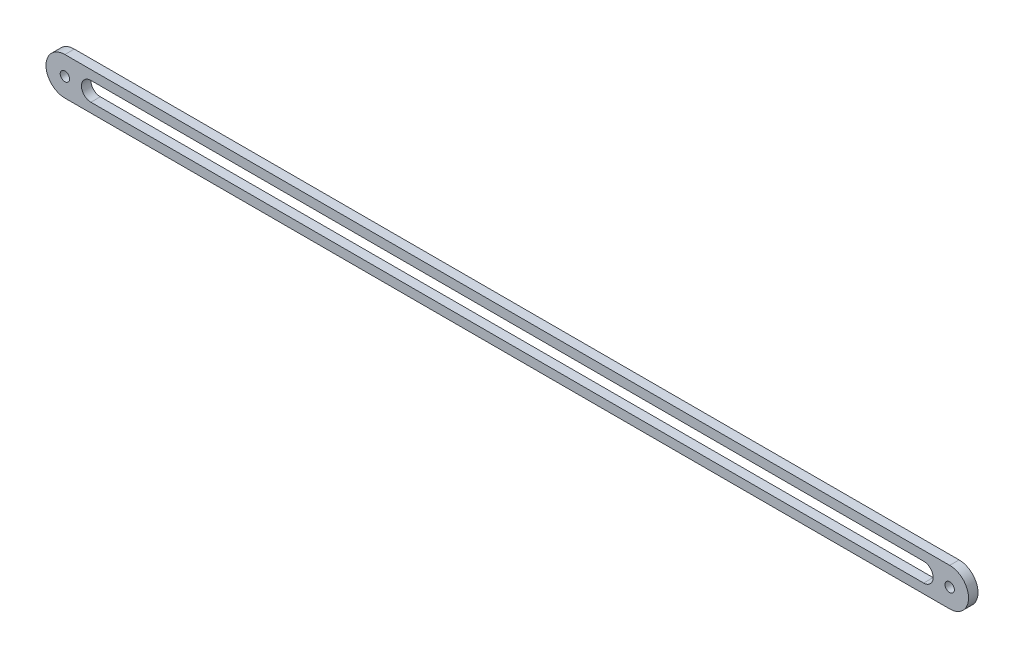
ISO-10303-21;
HEADER;
FILE_DESCRIPTION(('STEP AP214'),'2;1');
FILE_NAME('part.step','',(''),(''),'','','');
FILE_SCHEMA(('AUTOMOTIVE_DESIGN { 1 0 10303 214 1 1 1 1 }'));
ENDSEC;
DATA;
#1=APPLICATION_CONTEXT('core data for automotive mechanical design processes');
#2=APPLICATION_PROTOCOL_DEFINITION('international standard','automotive_design',2000,#1);
#3=PRODUCT_CONTEXT('',#1,'mechanical');
#4=PRODUCT('Part','Part','',(#3));
#5=PRODUCT_RELATED_PRODUCT_CATEGORY('part','',(#4));
#6=PRODUCT_DEFINITION_FORMATION('','',#4);
#7=PRODUCT_DEFINITION_CONTEXT('part definition',#1,'design');
#8=PRODUCT_DEFINITION('design','',#6,#7);
#9=PRODUCT_DEFINITION_SHAPE('','',#8);
#10=(LENGTH_UNIT() NAMED_UNIT(*) SI_UNIT(.MILLI.,.METRE.));
#11=(NAMED_UNIT(*) PLANE_ANGLE_UNIT() SI_UNIT($,.RADIAN.));
#12=(NAMED_UNIT(*) SI_UNIT($,.STERADIAN.) SOLID_ANGLE_UNIT());
#13=UNCERTAINTY_MEASURE_WITH_UNIT(LENGTH_MEASURE(1.E-05),#10,'distance_accuracy_value','');
#14=(GEOMETRIC_REPRESENTATION_CONTEXT(3) GLOBAL_UNCERTAINTY_ASSIGNED_CONTEXT((#13)) GLOBAL_UNIT_ASSIGNED_CONTEXT((#10,
#11,#12)) REPRESENTATION_CONTEXT('',''));
#15=CARTESIAN_POINT('',(0.,0.,0.));
#16=DIRECTION('',(0.,0.,1.));
#17=DIRECTION('',(1.,0.,0.));
#18=AXIS2_PLACEMENT_3D('',#15,#16,#17);
#19=CARTESIAN_POINT('',(-150.,2.22044604925031E-13,1.6));
#20=DIRECTION('',(0.,0.,1.));
#21=DIRECTION('',(1.,0.,0.));
#22=AXIS2_PLACEMENT_3D('',#19,#20,#21);
#23=PLANE('',#22);
#24=CARTESIAN_POINT('',(-150.,2.22044604925031E-13,1.6));
#25=DIRECTION('',(0.,0.,1.));
#26=DIRECTION('',(1.,0.,0.));
#27=AXIS2_PLACEMENT_3D('',#24,#25,#26);
#28=CIRCLE('',#27,1.58750000000007);
#29=CARTESIAN_POINT('',(-148.4125,2.22044604925031E-13,1.6));
#30=VERTEX_POINT('',#29);
#31=EDGE_CURVE('E140',#30,#30,#28,.T.);
#32=ORIENTED_EDGE('',*,*,#31,.F.);
#33=EDGE_LOOP('',(#32));
#34=FACE_BOUND('',#33,.T.);
#35=CARTESIAN_POINT('',(-150.,2.22044604925031E-13,1.6));
#36=DIRECTION('',(0.,0.,1.));
#37=DIRECTION('',(1.,0.,0.));
#38=AXIS2_PLACEMENT_3D('',#35,#36,#37);
#39=CIRCLE('',#38,6.40000000000009);
#40=CARTESIAN_POINT('',(-149.999999690548,6.40000000000018,1.6));
#41=VERTEX_POINT('',#40);
#42=CARTESIAN_POINT('',(-149.999999377234,-6.39999999999996,1.6));
#43=VERTEX_POINT('',#42);
#44=EDGE_CURVE('E146',#41,#43,#39,.T.);
#45=ORIENTED_EDGE('',*,*,#44,.T.);
#46=DIRECTION('',(1.,0.,0.));
#47=VECTOR('',#46,1.);
#48=CARTESIAN_POINT('',(149.999999377224,-6.39999999999996,1.6));
#49=LINE('',#48,#47);
#50=CARTESIAN_POINT('',(149.999999377224,-6.39999999999991,1.6));
#51=VERTEX_POINT('',#50);
#52=EDGE_CURVE('E149',#43,#51,#49,.T.);
#53=ORIENTED_EDGE('',*,*,#52,.T.);
#54=CARTESIAN_POINT('',(149.999999533881,1.65666091955785E-13,1.6));
#55=DIRECTION('',(0.,0.,1.));
#56=DIRECTION('',(1.,0.,0.));
#57=AXIS2_PLACEMENT_3D('',#54,#55,#56);
#58=CIRCLE('',#57,6.40000000000007);
#59=CARTESIAN_POINT('',(149.999999690539,6.40000000000018,1.6));
#60=VERTEX_POINT('',#59);
#61=EDGE_CURVE('E152',#51,#60,#58,.T.);
#62=ORIENTED_EDGE('',*,*,#61,.T.);
#63=DIRECTION('',(-1.,0.,0.));
#64=VECTOR('',#63,1.);
#65=CARTESIAN_POINT('',(-149.999999690548,6.40000000000018,1.6));
#66=LINE('',#65,#64);
#67=EDGE_CURVE('E154',#60,#41,#66,.T.);
#68=ORIENTED_EDGE('',*,*,#67,.T.);
#69=EDGE_LOOP('',(#45,#53,#62,#68));
#70=FACE_BOUND('',#69,.T.);
#71=CARTESIAN_POINT('',(149.999999533881,1.65666091955785E-13,1.6));
#72=DIRECTION('',(0.,0.,1.));
#73=DIRECTION('',(1.,0.,0.));
#74=AXIS2_PLACEMENT_3D('',#71,#72,#73);
#75=CIRCLE('',#74,1.58749999999984);
#76=CARTESIAN_POINT('',(151.587499533881,1.65666091955785E-13,1.6));
#77=VERTEX_POINT('',#76);
#78=EDGE_CURVE('E134',#77,#77,#75,.T.);
#79=ORIENTED_EDGE('',*,*,#78,.F.);
#80=EDGE_LOOP('',(#79));
#81=FACE_BOUND('',#80,.T.);
#82=DIRECTION('',(1.,0.,0.));
#83=VECTOR('',#82,1.);
#84=CARTESIAN_POINT('',(-141.185,-3.19999999999987,1.6));
#85=LINE('',#84,#83);
#86=CARTESIAN_POINT('',(-141.185,-3.19999999999987,1.6));
#87=VERTEX_POINT('',#86);
#88=CARTESIAN_POINT('',(141.185000000001,-3.19999999999976,1.6));
#89=VERTEX_POINT('',#88);
#90=EDGE_CURVE('E106',#87,#89,#85,.T.);
#91=ORIENTED_EDGE('',*,*,#90,.F.);
#92=CARTESIAN_POINT('',(-141.185,2.22044604925031E-13,1.6));
#93=DIRECTION('',(0.,0.,1.));
#94=DIRECTION('',(1.,0.,0.));
#95=AXIS2_PLACEMENT_3D('',#92,#93,#94);
#96=CIRCLE('',#95,3.19999999999998);
#97=CARTESIAN_POINT('',(-141.185,3.20000000000009,1.6));
#98=VERTEX_POINT('',#97);
#99=EDGE_CURVE('E98',#98,#87,#96,.T.);
#100=ORIENTED_EDGE('',*,*,#99,.F.);
#101=DIRECTION('',(-1.,0.,0.));
#102=VECTOR('',#101,1.);
#103=CARTESIAN_POINT('',(141.185000000001,3.20000000000009,1.6));
#104=LINE('',#103,#102);
#105=CARTESIAN_POINT('',(141.185000000001,3.20000000000009,1.6));
#106=VERTEX_POINT('',#105);
#107=EDGE_CURVE('E120',#106,#98,#104,.T.);
#108=ORIENTED_EDGE('',*,*,#107,.F.);
#109=CARTESIAN_POINT('',(141.185000000001,2.22044604925031E-13,1.6));
#110=DIRECTION('',(0.,0.,1.));
#111=DIRECTION('',(1.,0.,0.));
#112=AXIS2_PLACEMENT_3D('',#109,#110,#111);
#113=CIRCLE('',#112,3.19999999999998);
#114=EDGE_CURVE('E118',#89,#106,#113,.T.);
#115=ORIENTED_EDGE('',*,*,#114,.F.);
#116=EDGE_LOOP('',(#91,#100,#108,#115));
#117=FACE_BOUND('',#116,.T.);
#118=ADVANCED_FACE('F33',(#34,#70,#81,#117),#23,.T.);
#119=CARTESIAN_POINT('',(-150.,2.22044604925031E-13,-1.6));
#120=DIRECTION('',(0.,0.,1.));
#121=DIRECTION('',(1.,0.,0.));
#122=AXIS2_PLACEMENT_3D('',#119,#120,#121);
#123=PLANE('',#122);
#124=CARTESIAN_POINT('',(149.999999533881,1.65666091955785E-13,-1.6));
#125=DIRECTION('',(0.,0.,1.));
#126=DIRECTION('',(1.,0.,0.));
#127=AXIS2_PLACEMENT_3D('',#124,#125,#126);
#128=CIRCLE('',#127,1.58749999999984);
#129=CARTESIAN_POINT('',(151.587499533881,1.65666091955785E-13,-1.6));
#130=VERTEX_POINT('',#129);
#131=EDGE_CURVE('E114',#130,#130,#128,.T.);
#132=ORIENTED_EDGE('',*,*,#131,.T.);
#133=EDGE_LOOP('',(#132));
#134=FACE_BOUND('',#133,.T.);
#135=CARTESIAN_POINT('',(-150.,2.22044604925031E-13,-1.6));
#136=DIRECTION('',(0.,0.,1.));
#137=DIRECTION('',(1.,0.,0.));
#138=AXIS2_PLACEMENT_3D('',#135,#136,#137);
#139=CIRCLE('',#138,1.58750000000007);
#140=CARTESIAN_POINT('',(-148.4125,2.22044604925031E-13,-1.6));
#141=VERTEX_POINT('',#140);
#142=EDGE_CURVE('E137',#141,#141,#139,.T.);
#143=ORIENTED_EDGE('',*,*,#142,.T.);
#144=EDGE_LOOP('',(#143));
#145=FACE_BOUND('',#144,.T.);
#146=CARTESIAN_POINT('',(-150.,2.22044604925031E-13,-1.6));
#147=DIRECTION('',(0.,0.,1.));
#148=DIRECTION('',(1.,0.,0.));
#149=AXIS2_PLACEMENT_3D('',#146,#147,#148);
#150=CIRCLE('',#149,6.40000000000009);
#151=CARTESIAN_POINT('',(-149.999999690548,6.40000000000018,-1.6));
#152=VERTEX_POINT('',#151);
#153=CARTESIAN_POINT('',(-149.999999377234,-6.39999999999996,-1.6));
#154=VERTEX_POINT('',#153);
#155=EDGE_CURVE('E143',#152,#154,#150,.T.);
#156=ORIENTED_EDGE('',*,*,#155,.F.);
#157=DIRECTION('',(-1.,0.,0.));
#158=VECTOR('',#157,1.);
#159=CARTESIAN_POINT('',(-149.999999690548,6.40000000000018,-1.6));
#160=LINE('',#159,#158);
#161=CARTESIAN_POINT('',(149.999999690539,6.40000000000018,-1.6));
#162=VERTEX_POINT('',#161);
#163=EDGE_CURVE('E150',#162,#152,#160,.T.);
#164=ORIENTED_EDGE('',*,*,#163,.F.);
#165=CARTESIAN_POINT('',(149.999999533881,1.65666091955785E-13,-1.6));
#166=DIRECTION('',(0.,0.,1.));
#167=DIRECTION('',(1.,0.,0.));
#168=AXIS2_PLACEMENT_3D('',#165,#166,#167);
#169=CIRCLE('',#168,6.40000000000007);
#170=CARTESIAN_POINT('',(149.999999377224,-6.39999999999991,-1.6));
#171=VERTEX_POINT('',#170);
#172=EDGE_CURVE('E161',#171,#162,#169,.T.);
#173=ORIENTED_EDGE('',*,*,#172,.F.);
#174=DIRECTION('',(1.,0.,0.));
#175=VECTOR('',#174,1.);
#176=CARTESIAN_POINT('',(149.999999377224,-6.39999999999996,-1.6));
#177=LINE('',#176,#175);
#178=EDGE_CURVE('E159',#154,#171,#177,.T.);
#179=ORIENTED_EDGE('',*,*,#178,.F.);
#180=EDGE_LOOP('',(#156,#164,#173,#179));
#181=FACE_BOUND('',#180,.T.);
#182=CARTESIAN_POINT('',(-141.185,2.22044604925031E-13,-1.6));
#183=DIRECTION('',(0.,0.,1.));
#184=DIRECTION('',(1.,0.,0.));
#185=AXIS2_PLACEMENT_3D('',#182,#183,#184);
#186=CIRCLE('',#185,3.19999999999998);
#187=CARTESIAN_POINT('',(-141.185,3.20000000000009,-1.6));
#188=VERTEX_POINT('',#187);
#189=CARTESIAN_POINT('',(-141.185,-3.19999999999987,-1.6));
#190=VERTEX_POINT('',#189);
#191=EDGE_CURVE('E56',#188,#190,#186,.T.);
#192=ORIENTED_EDGE('',*,*,#191,.T.);
#193=DIRECTION('',(1.,0.,0.));
#194=VECTOR('',#193,1.);
#195=CARTESIAN_POINT('',(-141.185,-3.19999999999987,-1.6));
#196=LINE('',#195,#194);
#197=CARTESIAN_POINT('',(141.185000000001,-3.19999999999976,-1.6));
#198=VERTEX_POINT('',#197);
#199=EDGE_CURVE('E113',#190,#198,#196,.T.);
#200=ORIENTED_EDGE('',*,*,#199,.T.);
#201=CARTESIAN_POINT('',(141.185000000001,2.22044604925031E-13,-1.6));
#202=DIRECTION('',(0.,0.,1.));
#203=DIRECTION('',(1.,0.,0.));
#204=AXIS2_PLACEMENT_3D('',#201,#202,#203);
#205=CIRCLE('',#204,3.19999999999998);
#206=CARTESIAN_POINT('',(141.185000000001,3.20000000000009,-1.6));
#207=VERTEX_POINT('',#206);
#208=EDGE_CURVE('E126',#198,#207,#205,.T.);
#209=ORIENTED_EDGE('',*,*,#208,.T.);
#210=DIRECTION('',(-1.,0.,0.));
#211=VECTOR('',#210,1.);
#212=CARTESIAN_POINT('',(141.185000000001,3.20000000000009,-1.6));
#213=LINE('',#212,#211);
#214=EDGE_CURVE('E107',#207,#188,#213,.T.);
#215=ORIENTED_EDGE('',*,*,#214,.T.);
#216=EDGE_LOOP('',(#192,#200,#209,#215));
#217=FACE_BOUND('',#216,.T.);
#218=ADVANCED_FACE('F179',(#134,#145,#181,#217),#123,.F.);
#219=CARTESIAN_POINT('',(-150.,2.22044604925031E-13,1.6));
#220=DIRECTION('',(0.,0.,-1.));
#221=DIRECTION('',(-1.,0.,0.));
#222=AXIS2_PLACEMENT_3D('',#219,#220,#221);
#223=CYLINDRICAL_SURFACE('',#222,6.40000000000009);
#224=ORIENTED_EDGE('',*,*,#155,.T.);
#225=DIRECTION('',(0.,0.,-1.));
#226=VECTOR('',#225,1.);
#227=CARTESIAN_POINT('',(-149.999999377234,-6.39999999999996,1.6));
#228=LINE('',#227,#226);
#229=EDGE_CURVE('E11',#43,#154,#228,.T.);
#230=ORIENTED_EDGE('',*,*,#229,.F.);
#231=ORIENTED_EDGE('',*,*,#44,.F.);
#232=DIRECTION('',(0.,0.,-1.));
#233=VECTOR('',#232,1.);
#234=CARTESIAN_POINT('',(-149.999999690548,6.40000000000018,1.6));
#235=LINE('',#234,#233);
#236=EDGE_CURVE('E156',#41,#152,#235,.T.);
#237=ORIENTED_EDGE('',*,*,#236,.T.);
#238=EDGE_LOOP('',(#224,#230,#231,#237));
#239=FACE_BOUND('',#238,.T.);
#240=ADVANCED_FACE('F35',(#239),#223,.T.);
#241=CARTESIAN_POINT('',(149.999999377224,-6.39999999999996,1.6));
#242=DIRECTION('',(0.,1.,0.));
#243=DIRECTION('',(0.,0.,1.));
#244=AXIS2_PLACEMENT_3D('',#241,#242,#243);
#245=PLANE('',#244);
#246=ORIENTED_EDGE('',*,*,#178,.T.);
#247=DIRECTION('',(0.,0.,-1.));
#248=VECTOR('',#247,1.);
#249=CARTESIAN_POINT('',(149.999999377224,-6.39999999999991,1.6));
#250=LINE('',#249,#248);
#251=EDGE_CURVE('E41',#51,#171,#250,.T.);
#252=ORIENTED_EDGE('',*,*,#251,.F.);
#253=ORIENTED_EDGE('',*,*,#52,.F.);
#254=ORIENTED_EDGE('',*,*,#229,.T.);
#255=EDGE_LOOP('',(#246,#252,#253,#254));
#256=FACE_BOUND('',#255,.T.);
#257=ADVANCED_FACE('F190',(#256),#245,.F.);
#258=CARTESIAN_POINT('',(149.999999533881,1.65666091955785E-13,1.6));
#259=DIRECTION('',(0.,0.,-1.));
#260=DIRECTION('',(-1.,0.,0.));
#261=AXIS2_PLACEMENT_3D('',#258,#259,#260);
#262=CYLINDRICAL_SURFACE('',#261,6.40000000000007);
#263=ORIENTED_EDGE('',*,*,#172,.T.);
#264=DIRECTION('',(0.,0.,-1.));
#265=VECTOR('',#264,1.);
#266=CARTESIAN_POINT('',(149.999999690539,6.40000000000018,1.6));
#267=LINE('',#266,#265);
#268=EDGE_CURVE('E166',#60,#162,#267,.T.);
#269=ORIENTED_EDGE('',*,*,#268,.F.);
#270=ORIENTED_EDGE('',*,*,#61,.F.);
#271=ORIENTED_EDGE('',*,*,#251,.T.);
#272=EDGE_LOOP('',(#263,#269,#270,#271));
#273=FACE_BOUND('',#272,.T.);
#274=ADVANCED_FACE('F173',(#273),#262,.T.);
#275=CARTESIAN_POINT('',(-149.999999690548,6.40000000000018,1.6));
#276=DIRECTION('',(0.,-1.,0.));
#277=DIRECTION('',(0.,0.,-1.));
#278=AXIS2_PLACEMENT_3D('',#275,#276,#277);
#279=PLANE('',#278);
#280=ORIENTED_EDGE('',*,*,#163,.T.);
#281=ORIENTED_EDGE('',*,*,#236,.F.);
#282=ORIENTED_EDGE('',*,*,#67,.F.);
#283=ORIENTED_EDGE('',*,*,#268,.T.);
#284=EDGE_LOOP('',(#280,#281,#282,#283));
#285=FACE_BOUND('',#284,.T.);
#286=ADVANCED_FACE('F183',(#285),#279,.F.);
#287=CARTESIAN_POINT('',(-150.,2.22044604925031E-13,1.6));
#288=DIRECTION('',(0.,0.,-1.));
#289=DIRECTION('',(-1.,0.,0.));
#290=AXIS2_PLACEMENT_3D('',#287,#288,#289);
#291=CYLINDRICAL_SURFACE('',#290,1.58750000000007);
#292=ORIENTED_EDGE('',*,*,#31,.T.);
#293=EDGE_LOOP('',(#292));
#294=FACE_BOUND('',#293,.T.);
#295=ORIENTED_EDGE('',*,*,#142,.F.);
#296=EDGE_LOOP('',(#295));
#297=FACE_BOUND('',#296,.T.);
#298=ADVANCED_FACE('F207',(#294,#297),#291,.F.);
#299=CARTESIAN_POINT('',(149.999999533881,1.65666091955785E-13,1.6));
#300=DIRECTION('',(0.,0.,-1.));
#301=DIRECTION('',(-1.,0.,0.));
#302=AXIS2_PLACEMENT_3D('',#299,#300,#301);
#303=CYLINDRICAL_SURFACE('',#302,1.58749999999984);
#304=ORIENTED_EDGE('',*,*,#78,.T.);
#305=EDGE_LOOP('',(#304));
#306=FACE_BOUND('',#305,.T.);
#307=ORIENTED_EDGE('',*,*,#131,.F.);
#308=EDGE_LOOP('',(#307));
#309=FACE_BOUND('',#308,.T.);
#310=ADVANCED_FACE('F214',(#306,#309),#303,.F.);
#311=CARTESIAN_POINT('',(-141.185,2.22044604925031E-13,1.6));
#312=DIRECTION('',(0.,0.,-1.));
#313=DIRECTION('',(-1.,0.,0.));
#314=AXIS2_PLACEMENT_3D('',#311,#312,#313);
#315=CYLINDRICAL_SURFACE('',#314,3.19999999999998);
#316=ORIENTED_EDGE('',*,*,#191,.F.);
#317=DIRECTION('',(0.,0.,-1.));
#318=VECTOR('',#317,1.);
#319=CARTESIAN_POINT('',(-141.185,3.20000000000009,1.6));
#320=LINE('',#319,#318);
#321=EDGE_CURVE('E102',#98,#188,#320,.T.);
#322=ORIENTED_EDGE('',*,*,#321,.F.);
#323=ORIENTED_EDGE('',*,*,#99,.T.);
#324=DIRECTION('',(0.,0.,-1.));
#325=VECTOR('',#324,1.);
#326=CARTESIAN_POINT('',(-141.185,-3.19999999999987,1.6));
#327=LINE('',#326,#325);
#328=EDGE_CURVE('E101',#87,#190,#327,.T.);
#329=ORIENTED_EDGE('',*,*,#328,.T.);
#330=EDGE_LOOP('',(#316,#322,#323,#329));
#331=FACE_BOUND('',#330,.T.);
#332=ADVANCED_FACE('F100',(#331),#315,.F.);
#333=CARTESIAN_POINT('',(-141.185,-3.19999999999987,1.6));
#334=DIRECTION('',(0.,1.,0.));
#335=DIRECTION('',(0.,0.,1.));
#336=AXIS2_PLACEMENT_3D('',#333,#334,#335);
#337=PLANE('',#336);
#338=ORIENTED_EDGE('',*,*,#199,.F.);
#339=ORIENTED_EDGE('',*,*,#328,.F.);
#340=ORIENTED_EDGE('',*,*,#90,.T.);
#341=DIRECTION('',(0.,0.,-1.));
#342=VECTOR('',#341,1.);
#343=CARTESIAN_POINT('',(141.185000000001,-3.19999999999976,1.6));
#344=LINE('',#343,#342);
#345=EDGE_CURVE('E115',#89,#198,#344,.T.);
#346=ORIENTED_EDGE('',*,*,#345,.T.);
#347=EDGE_LOOP('',(#338,#339,#340,#346));
#348=FACE_BOUND('',#347,.T.);
#349=ADVANCED_FACE('F110',(#348),#337,.T.);
#350=CARTESIAN_POINT('',(141.185000000001,2.22044604925031E-13,1.6));
#351=DIRECTION('',(0.,0.,-1.));
#352=DIRECTION('',(-1.,0.,0.));
#353=AXIS2_PLACEMENT_3D('',#350,#351,#352);
#354=CYLINDRICAL_SURFACE('',#353,3.19999999999998);
#355=ORIENTED_EDGE('',*,*,#208,.F.);
#356=ORIENTED_EDGE('',*,*,#345,.F.);
#357=ORIENTED_EDGE('',*,*,#114,.T.);
#358=DIRECTION('',(0.,0.,-1.));
#359=VECTOR('',#358,1.);
#360=CARTESIAN_POINT('',(141.185000000001,3.20000000000009,1.6));
#361=LINE('',#360,#359);
#362=EDGE_CURVE('E48',#106,#207,#361,.T.);
#363=ORIENTED_EDGE('',*,*,#362,.T.);
#364=EDGE_LOOP('',(#355,#356,#357,#363));
#365=FACE_BOUND('',#364,.T.);
#366=ADVANCED_FACE('F231',(#365),#354,.F.);
#367=CARTESIAN_POINT('',(141.185000000001,3.20000000000009,1.6));
#368=DIRECTION('',(0.,-1.,0.));
#369=DIRECTION('',(0.,0.,-1.));
#370=AXIS2_PLACEMENT_3D('',#367,#368,#369);
#371=PLANE('',#370);
#372=ORIENTED_EDGE('',*,*,#214,.F.);
#373=ORIENTED_EDGE('',*,*,#362,.F.);
#374=ORIENTED_EDGE('',*,*,#107,.T.);
#375=ORIENTED_EDGE('',*,*,#321,.T.);
#376=EDGE_LOOP('',(#372,#373,#374,#375));
#377=FACE_BOUND('',#376,.T.);
#378=ADVANCED_FACE('F234',(#377),#371,.T.);
#379=CLOSED_SHELL('',(#118,#218,#240,#257,#274,#286,#298,#310,#332,#349,#366,#378));
#380=MANIFOLD_SOLID_BREP('B2',#379);
#381=ADVANCED_BREP_SHAPE_REPRESENTATION('',(#18,#380),#14);
#382=SHAPE_DEFINITION_REPRESENTATION(#9,#381);
ENDSEC;
END-ISO-10303-21;
